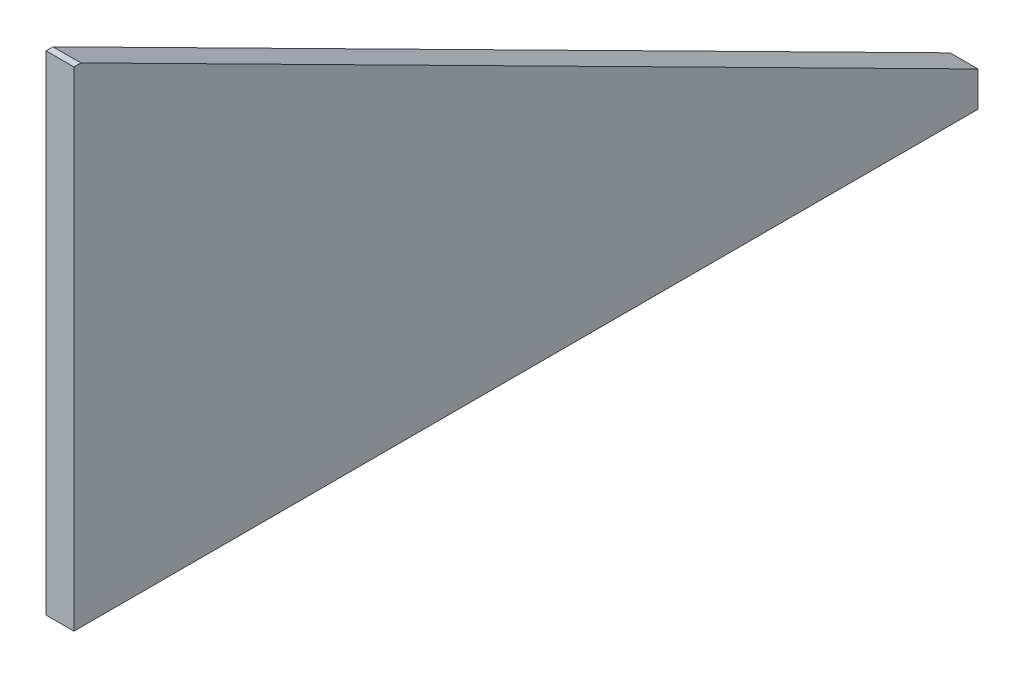
ISO-10303-21;
HEADER;
FILE_DESCRIPTION(('STEP AP214'),'2;1');
FILE_NAME('part.step','',(''),(''),'','','');
FILE_SCHEMA(('AUTOMOTIVE_DESIGN { 1 0 10303 214 1 1 1 1 }'));
ENDSEC;
DATA;
#1=APPLICATION_CONTEXT('core data for automotive mechanical design processes');
#2=APPLICATION_PROTOCOL_DEFINITION('international standard','automotive_design',2000,#1);
#3=PRODUCT_CONTEXT('',#1,'mechanical');
#4=PRODUCT('Part','Part','',(#3));
#5=PRODUCT_RELATED_PRODUCT_CATEGORY('part','',(#4));
#6=PRODUCT_DEFINITION_FORMATION('','',#4);
#7=PRODUCT_DEFINITION_CONTEXT('part definition',#1,'design');
#8=PRODUCT_DEFINITION('design','',#6,#7);
#9=PRODUCT_DEFINITION_SHAPE('','',#8);
#10=(LENGTH_UNIT() NAMED_UNIT(*) SI_UNIT(.MILLI.,.METRE.));
#11=(NAMED_UNIT(*) PLANE_ANGLE_UNIT() SI_UNIT($,.RADIAN.));
#12=(NAMED_UNIT(*) SI_UNIT($,.STERADIAN.) SOLID_ANGLE_UNIT());
#13=UNCERTAINTY_MEASURE_WITH_UNIT(LENGTH_MEASURE(1.E-05),#10,'distance_accuracy_value','');
#14=(GEOMETRIC_REPRESENTATION_CONTEXT(3) GLOBAL_UNCERTAINTY_ASSIGNED_CONTEXT((#13)) GLOBAL_UNIT_ASSIGNED_CONTEXT((#10,
#11,#12)) REPRESENTATION_CONTEXT('',''));
#15=CARTESIAN_POINT('',(0.,0.,0.));
#16=DIRECTION('',(0.,0.,1.));
#17=DIRECTION('',(1.,0.,0.));
#18=AXIS2_PLACEMENT_3D('',#15,#16,#17);
#19=CARTESIAN_POINT('',(-16.,0.,-518.));
#20=DIRECTION('',(0.,-1.,0.));
#21=DIRECTION('',(0.,0.,-1.));
#22=AXIS2_PLACEMENT_3D('',#19,#20,#21);
#23=PLANE('',#22);
#24=DIRECTION('',(0.,0.,-1.));
#25=VECTOR('',#24,1.);
#26=CARTESIAN_POINT('',(0.,0.,-518.));
#27=LINE('',#26,#25);
#28=CARTESIAN_POINT('',(0.,0.,0.));
#29=VERTEX_POINT('',#28);
#30=CARTESIAN_POINT('',(0.,0.,-518.));
#31=VERTEX_POINT('',#30);
#32=EDGE_CURVE('E113',#29,#31,#27,.T.);
#33=ORIENTED_EDGE('',*,*,#32,.F.);
#34=DIRECTION('',(1.,0.,0.));
#35=VECTOR('',#34,1.);
#36=CARTESIAN_POINT('',(-16.,0.,0.));
#37=LINE('',#36,#35);
#38=CARTESIAN_POINT('',(-16.,0.,0.));
#39=VERTEX_POINT('',#38);
#40=EDGE_CURVE('E11',#39,#29,#37,.T.);
#41=ORIENTED_EDGE('',*,*,#40,.F.);
#42=DIRECTION('',(0.,0.,-1.));
#43=VECTOR('',#42,1.);
#44=CARTESIAN_POINT('',(-16.,0.,-518.));
#45=LINE('',#44,#43);
#46=CARTESIAN_POINT('',(-16.,0.,-518.));
#47=VERTEX_POINT('',#46);
#48=EDGE_CURVE('E108',#39,#47,#45,.T.);
#49=ORIENTED_EDGE('',*,*,#48,.T.);
#50=DIRECTION('',(1.,0.,0.));
#51=VECTOR('',#50,1.);
#52=CARTESIAN_POINT('',(-16.,0.,-518.));
#53=LINE('',#52,#51);
#54=EDGE_CURVE('E39',#47,#31,#53,.T.);
#55=ORIENTED_EDGE('',*,*,#54,.T.);
#56=EDGE_LOOP('',(#33,#41,#49,#55));
#57=FACE_BOUND('',#56,.T.);
#58=ADVANCED_FACE('F36',(#57),#23,.T.);
#59=CARTESIAN_POINT('',(-16.,0.,0.));
#60=DIRECTION('',(0.,0.,1.));
#61=DIRECTION('',(1.,0.,0.));
#62=AXIS2_PLACEMENT_3D('',#59,#60,#61);
#63=PLANE('',#62);
#64=DIRECTION('',(0.,-1.,0.));
#65=VECTOR('',#64,1.);
#66=CARTESIAN_POINT('',(0.,0.,0.));
#67=LINE('',#66,#65);
#68=CARTESIAN_POINT('',(0.,280.,0.));
#69=VERTEX_POINT('',#68);
#70=EDGE_CURVE('E122',#69,#29,#67,.T.);
#71=ORIENTED_EDGE('',*,*,#70,.F.);
#72=DIRECTION('',(1.,0.,0.));
#73=VECTOR('',#72,1.);
#74=CARTESIAN_POINT('',(-16.,280.,0.));
#75=LINE('',#74,#73);
#76=CARTESIAN_POINT('',(-16.,280.,0.));
#77=VERTEX_POINT('',#76);
#78=EDGE_CURVE('E45',#77,#69,#75,.T.);
#79=ORIENTED_EDGE('',*,*,#78,.F.);
#80=DIRECTION('',(0.,-1.,0.));
#81=VECTOR('',#80,1.);
#82=CARTESIAN_POINT('',(-16.,0.,0.));
#83=LINE('',#82,#81);
#84=EDGE_CURVE('E103',#77,#39,#83,.T.);
#85=ORIENTED_EDGE('',*,*,#84,.T.);
#86=ORIENTED_EDGE('',*,*,#40,.T.);
#87=EDGE_LOOP('',(#71,#79,#85,#86));
#88=FACE_BOUND('',#87,.T.);
#89=ADVANCED_FACE('F128',(#88),#63,.T.);
#90=CARTESIAN_POINT('',(-16.,280.,0.));
#91=DIRECTION('',(0.,1.,0.));
#92=DIRECTION('',(0.,0.,1.));
#93=AXIS2_PLACEMENT_3D('',#90,#91,#92);
#94=PLANE('',#93);
#95=DIRECTION('',(0.,0.,1.));
#96=VECTOR('',#95,1.);
#97=CARTESIAN_POINT('',(0.,280.,0.));
#98=LINE('',#97,#96);
#99=CARTESIAN_POINT('',(0.,280.,-4.));
#100=VERTEX_POINT('',#99);
#101=EDGE_CURVE('E92',#100,#69,#98,.T.);
#102=ORIENTED_EDGE('',*,*,#101,.F.);
#103=DIRECTION('',(1.,0.,0.));
#104=VECTOR('',#103,1.);
#105=CARTESIAN_POINT('',(-16.,280.,-4.));
#106=LINE('',#105,#104);
#107=CARTESIAN_POINT('',(-16.,280.,-4.));
#108=VERTEX_POINT('',#107);
#109=EDGE_CURVE('E87',#108,#100,#106,.T.);
#110=ORIENTED_EDGE('',*,*,#109,.F.);
#111=DIRECTION('',(0.,0.,1.));
#112=VECTOR('',#111,1.);
#113=CARTESIAN_POINT('',(-16.,280.,0.));
#114=LINE('',#113,#112);
#115=EDGE_CURVE('E90',#108,#77,#114,.T.);
#116=ORIENTED_EDGE('',*,*,#115,.T.);
#117=ORIENTED_EDGE('',*,*,#78,.T.);
#118=EDGE_LOOP('',(#102,#110,#116,#117));
#119=FACE_BOUND('',#118,.T.);
#120=ADVANCED_FACE('F89',(#119),#94,.T.);
#121=CARTESIAN_POINT('',(-16.,280.,-4.));
#122=DIRECTION('',(0.,0.892334215833321,-0.451375284273665));
#123=DIRECTION('',(0.,0.451375284273665,0.892334215833321));
#124=AXIS2_PLACEMENT_3D('',#121,#122,#123);
#125=PLANE('',#124);
#126=DIRECTION('',(0.,0.451375284273665,0.892334215833321));
#127=VECTOR('',#126,1.);
#128=CARTESIAN_POINT('',(0.,280.,-4.));
#129=LINE('',#128,#127);
#130=CARTESIAN_POINT('',(0.,20.,-518.));
#131=VERTEX_POINT('',#130);
#132=EDGE_CURVE('E119',#131,#100,#129,.T.);
#133=ORIENTED_EDGE('',*,*,#132,.F.);
#134=DIRECTION('',(1.,0.,0.));
#135=VECTOR('',#134,1.);
#136=CARTESIAN_POINT('',(-16.,20.,-518.));
#137=LINE('',#136,#135);
#138=CARTESIAN_POINT('',(-16.,20.,-518.));
#139=VERTEX_POINT('',#138);
#140=EDGE_CURVE('E97',#139,#131,#137,.T.);
#141=ORIENTED_EDGE('',*,*,#140,.F.);
#142=DIRECTION('',(0.,0.451375284273665,0.892334215833321));
#143=VECTOR('',#142,1.);
#144=CARTESIAN_POINT('',(-16.,280.,-4.));
#145=LINE('',#144,#143);
#146=EDGE_CURVE('E102',#139,#108,#145,.T.);
#147=ORIENTED_EDGE('',*,*,#146,.T.);
#148=ORIENTED_EDGE('',*,*,#109,.T.);
#149=EDGE_LOOP('',(#133,#141,#147,#148));
#150=FACE_BOUND('',#149,.T.);
#151=ADVANCED_FACE('F105',(#150),#125,.T.);
#152=CARTESIAN_POINT('',(-16.,20.,-518.));
#153=DIRECTION('',(0.,0.,-1.));
#154=DIRECTION('',(-1.,0.,0.));
#155=AXIS2_PLACEMENT_3D('',#152,#153,#154);
#156=PLANE('',#155);
#157=DIRECTION('',(0.,1.,0.));
#158=VECTOR('',#157,1.);
#159=CARTESIAN_POINT('',(0.,20.,-518.));
#160=LINE('',#159,#158);
#161=EDGE_CURVE('E116',#31,#131,#160,.T.);
#162=ORIENTED_EDGE('',*,*,#161,.F.);
#163=ORIENTED_EDGE('',*,*,#54,.F.);
#164=DIRECTION('',(0.,1.,0.));
#165=VECTOR('',#164,1.);
#166=CARTESIAN_POINT('',(-16.,20.,-518.));
#167=LINE('',#166,#165);
#168=EDGE_CURVE('E106',#47,#139,#167,.T.);
#169=ORIENTED_EDGE('',*,*,#168,.T.);
#170=ORIENTED_EDGE('',*,*,#140,.T.);
#171=EDGE_LOOP('',(#162,#163,#169,#170));
#172=FACE_BOUND('',#171,.T.);
#173=ADVANCED_FACE('F125',(#172),#156,.T.);
#174=CARTESIAN_POINT('',(-16.,0.,0.));
#175=DIRECTION('',(-1.,0.,0.));
#176=DIRECTION('',(0.,0.,1.));
#177=AXIS2_PLACEMENT_3D('',#174,#175,#176);
#178=PLANE('',#177);
#179=ORIENTED_EDGE('',*,*,#48,.F.);
#180=ORIENTED_EDGE('',*,*,#84,.F.);
#181=ORIENTED_EDGE('',*,*,#115,.F.);
#182=ORIENTED_EDGE('',*,*,#146,.F.);
#183=ORIENTED_EDGE('',*,*,#168,.F.);
#184=EDGE_LOOP('',(#179,#180,#181,#182,#183));
#185=FACE_BOUND('',#184,.T.);
#186=ADVANCED_FACE('F101',(#185),#178,.T.);
#187=CARTESIAN_POINT('',(0.,0.,0.));
#188=DIRECTION('',(-1.,0.,0.));
#189=DIRECTION('',(0.,0.,1.));
#190=AXIS2_PLACEMENT_3D('',#187,#188,#189);
#191=PLANE('',#190);
#192=ORIENTED_EDGE('',*,*,#32,.T.);
#193=ORIENTED_EDGE('',*,*,#161,.T.);
#194=ORIENTED_EDGE('',*,*,#132,.T.);
#195=ORIENTED_EDGE('',*,*,#101,.T.);
#196=ORIENTED_EDGE('',*,*,#70,.T.);
#197=EDGE_LOOP('',(#192,#193,#194,#195,#196));
#198=FACE_BOUND('',#197,.T.);
#199=ADVANCED_FACE('F127',(#198),#191,.F.);
#200=CLOSED_SHELL('',(#58,#89,#120,#151,#173,#186,#199));
#201=MANIFOLD_SOLID_BREP('B2',#200);
#202=ADVANCED_BREP_SHAPE_REPRESENTATION('',(#18,#201),#14);
#203=SHAPE_DEFINITION_REPRESENTATION(#9,#202);
ENDSEC;
END-ISO-10303-21;
